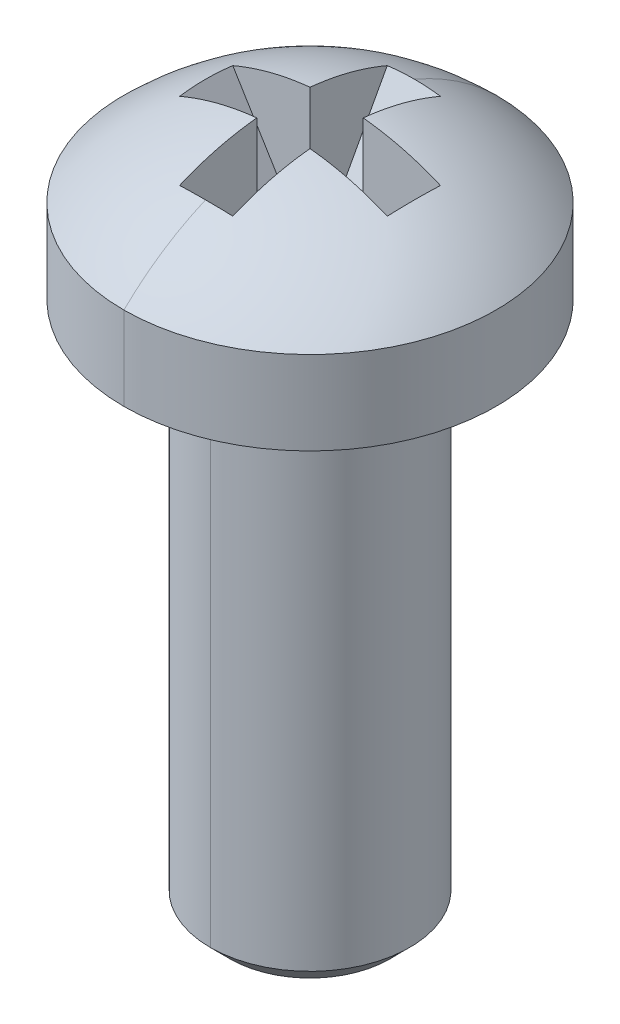
ISO-10303-21;
HEADER;
FILE_DESCRIPTION(('STEP AP214'),'2;1');
FILE_NAME('part.step','',(''),(''),'','','');
FILE_SCHEMA(('AUTOMOTIVE_DESIGN { 1 0 10303 214 1 1 1 1 }'));
ENDSEC;
DATA;
#1=APPLICATION_CONTEXT('core data for automotive mechanical design processes');
#2=APPLICATION_PROTOCOL_DEFINITION('international standard','automotive_design',2000,#1);
#3=PRODUCT_CONTEXT('',#1,'mechanical');
#4=PRODUCT('Part','Part','',(#3));
#5=PRODUCT_RELATED_PRODUCT_CATEGORY('part','',(#4));
#6=PRODUCT_DEFINITION_FORMATION('','',#4);
#7=PRODUCT_DEFINITION_CONTEXT('part definition',#1,'design');
#8=PRODUCT_DEFINITION('design','',#6,#7);
#9=PRODUCT_DEFINITION_SHAPE('','',#8);
#10=(LENGTH_UNIT() NAMED_UNIT(*) SI_UNIT(.MILLI.,.METRE.));
#11=(NAMED_UNIT(*) PLANE_ANGLE_UNIT() SI_UNIT($,.RADIAN.));
#12=(NAMED_UNIT(*) SI_UNIT($,.STERADIAN.) SOLID_ANGLE_UNIT());
#13=UNCERTAINTY_MEASURE_WITH_UNIT(LENGTH_MEASURE(1.E-05),#10,'distance_accuracy_value','');
#14=(GEOMETRIC_REPRESENTATION_CONTEXT(3) GLOBAL_UNCERTAINTY_ASSIGNED_CONTEXT((#13)) GLOBAL_UNIT_ASSIGNED_CONTEXT((#10,
#11,#12)) REPRESENTATION_CONTEXT('',''));
#15=CARTESIAN_POINT('',(0.,0.,0.));
#16=DIRECTION('',(0.,0.,1.));
#17=DIRECTION('',(1.,0.,0.));
#18=AXIS2_PLACEMENT_3D('',#15,#16,#17);
#19=CARTESIAN_POINT('',(0.,-8.,0.));
#20=DIRECTION('',(0.,-1.,0.));
#21=DIRECTION('',(0.,0.,-1.));
#22=AXIS2_PLACEMENT_3D('',#19,#20,#21);
#23=PLANE('',#22);
#24=CARTESIAN_POINT('',(0.,-8.,0.));
#25=DIRECTION('',(0.,-1.,0.));
#26=DIRECTION('',(0.,0.,-1.));
#27=AXIS2_PLACEMENT_3D('',#24,#25,#26);
#28=CIRCLE('',#27,1.2);
#29=CARTESIAN_POINT('',(0.,-8.,-1.2));
#30=VERTEX_POINT('',#29);
#31=CARTESIAN_POINT('',(0.,-8.,1.2));
#32=VERTEX_POINT('',#31);
#33=EDGE_CURVE('P0_E11',#30,#32,#28,.T.);
#34=ORIENTED_EDGE('',*,*,#33,.T.);
#35=CARTESIAN_POINT('',(0.,-8.,0.));
#36=DIRECTION('',(0.,1.,0.));
#37=DIRECTION('',(0.,0.,-1.));
#38=AXIS2_PLACEMENT_3D('',#35,#36,#37);
#39=CIRCLE('',#38,1.2);
#40=EDGE_CURVE('P0_E271',#30,#32,#39,.T.);
#41=ORIENTED_EDGE('',*,*,#40,.F.);
#42=EDGE_LOOP('',(#34,#41));
#43=FACE_BOUND('',#42,.T.);
#44=ADVANCED_FACE('P0_F17',(#43),#23,.T.);
#45=CARTESIAN_POINT('',(0.,-7.85,0.));
#46=DIRECTION('',(0.,1.,0.));
#47=DIRECTION('',(0.,0.,-1.));
#48=AXIS2_PLACEMENT_3D('',#45,#46,#47);
#49=CONICAL_SURFACE('',#48,1.35,0.7853981633973);
#50=CARTESIAN_POINT('',(0.,-7.7,0.));
#51=DIRECTION('',(0.,-1.,0.));
#52=DIRECTION('',(0.,0.,-1.));
#53=AXIS2_PLACEMENT_3D('',#50,#51,#52);
#54=CIRCLE('',#53,1.5);
#55=CARTESIAN_POINT('',(0.,-7.7,-1.5));
#56=VERTEX_POINT('',#55);
#57=CARTESIAN_POINT('',(0.,-7.7,1.5));
#58=VERTEX_POINT('',#57);
#59=EDGE_CURVE('P0_E171',#56,#58,#54,.T.);
#60=ORIENTED_EDGE('',*,*,#59,.T.);
#61=DIRECTION('',(0.,0.707106781186498,0.707106781186598));
#62=VECTOR('',#61,1.);
#63=CARTESIAN_POINT('',(0.,-8.,1.2));
#64=LINE('',#63,#62);
#65=EDGE_CURVE('P0_E20',#32,#58,#64,.T.);
#66=ORIENTED_EDGE('',*,*,#65,.F.);
#67=ORIENTED_EDGE('',*,*,#33,.F.);
#68=DIRECTION('',(0.,0.707106781186498,-0.707106781186598));
#69=VECTOR('',#68,1.);
#70=CARTESIAN_POINT('',(0.,-8.,-1.2));
#71=LINE('',#70,#69);
#72=EDGE_CURVE('P0_E26',#30,#56,#71,.T.);
#73=ORIENTED_EDGE('',*,*,#72,.T.);
#74=EDGE_LOOP('',(#60,#66,#67,#73));
#75=FACE_BOUND('',#74,.T.);
#76=ADVANCED_FACE('P0_F566',(#75),#49,.T.);
#77=CARTESIAN_POINT('',(0.,-7.85,0.));
#78=DIRECTION('',(0.,1.,0.));
#79=DIRECTION('',(0.,0.,-1.));
#80=AXIS2_PLACEMENT_3D('',#77,#78,#79);
#81=CONICAL_SURFACE('',#80,1.35,0.7853981633973);
#82=ORIENTED_EDGE('',*,*,#40,.T.);
#83=ORIENTED_EDGE('',*,*,#65,.T.);
#84=CARTESIAN_POINT('',(0.,-7.7,0.));
#85=DIRECTION('',(0.,1.,0.));
#86=DIRECTION('',(0.,0.,-1.));
#87=AXIS2_PLACEMENT_3D('',#84,#85,#86);
#88=CIRCLE('',#87,1.5);
#89=EDGE_CURVE('P0_E166',#56,#58,#88,.T.);
#90=ORIENTED_EDGE('',*,*,#89,.F.);
#91=ORIENTED_EDGE('',*,*,#72,.F.);
#92=EDGE_LOOP('',(#82,#83,#90,#91));
#93=FACE_BOUND('',#92,.T.);
#94=ADVANCED_FACE('P0_F570',(#93),#81,.T.);
#95=CARTESIAN_POINT('',(0.,2.92,0.));
#96=DIRECTION('',(0.,-1.,0.));
#97=DIRECTION('',(0.,0.,1.));
#98=AXIS2_PLACEMENT_3D('',#95,#96,#97);
#99=CYLINDRICAL_SURFACE('',#98,1.5);
#100=ORIENTED_EDGE('',*,*,#89,.T.);
#101=DIRECTION('',(0.,1.,0.));
#102=VECTOR('',#101,1.);
#103=CARTESIAN_POINT('',(0.,-7.7,1.5));
#104=LINE('',#103,#102);
#105=CARTESIAN_POINT('',(0.,0.,1.5));
#106=VERTEX_POINT('',#105);
#107=EDGE_CURVE('P0_E159',#58,#106,#104,.T.);
#108=ORIENTED_EDGE('',*,*,#107,.T.);
#109=CARTESIAN_POINT('',(0.,0.,0.));
#110=DIRECTION('',(0.,1.,0.));
#111=DIRECTION('',(0.,0.,-1.));
#112=AXIS2_PLACEMENT_3D('',#109,#110,#111);
#113=CIRCLE('',#112,1.5);
#114=CARTESIAN_POINT('',(0.,0.,-1.5));
#115=VERTEX_POINT('',#114);
#116=EDGE_CURVE('P0_E164',#115,#106,#113,.T.);
#117=ORIENTED_EDGE('',*,*,#116,.F.);
#118=DIRECTION('',(0.,1.,0.));
#119=VECTOR('',#118,1.);
#120=CARTESIAN_POINT('',(0.,-7.7,-1.5));
#121=LINE('',#120,#119);
#122=EDGE_CURVE('P0_E176',#56,#115,#121,.T.);
#123=ORIENTED_EDGE('',*,*,#122,.F.);
#124=EDGE_LOOP('',(#100,#108,#117,#123));
#125=FACE_BOUND('',#124,.T.);
#126=ADVANCED_FACE('P0_F161',(#125),#99,.T.);
#127=CARTESIAN_POINT('',(0.,2.92,0.));
#128=DIRECTION('',(0.,-1.,0.));
#129=DIRECTION('',(0.,0.,1.));
#130=AXIS2_PLACEMENT_3D('',#127,#128,#129);
#131=CYLINDRICAL_SURFACE('',#130,1.5);
#132=CARTESIAN_POINT('',(0.,0.,0.));
#133=DIRECTION('',(0.,-1.,0.));
#134=DIRECTION('',(0.,0.,-1.));
#135=AXIS2_PLACEMENT_3D('',#132,#133,#134);
#136=CIRCLE('',#135,1.5);
#137=EDGE_CURVE('P0_E172',#115,#106,#136,.T.);
#138=ORIENTED_EDGE('',*,*,#137,.T.);
#139=ORIENTED_EDGE('',*,*,#107,.F.);
#140=ORIENTED_EDGE('',*,*,#59,.F.);
#141=ORIENTED_EDGE('',*,*,#122,.T.);
#142=EDGE_LOOP('',(#138,#139,#140,#141));
#143=FACE_BOUND('',#142,.T.);
#144=ADVANCED_FACE('P0_F175',(#143),#131,.T.);
#145=CARTESIAN_POINT('',(0.,0.,0.));
#146=DIRECTION('',(0.,-1.,0.));
#147=DIRECTION('',(0.,0.,-1.));
#148=AXIS2_PLACEMENT_3D('',#145,#146,#147);
#149=PLANE('',#148);
#150=ORIENTED_EDGE('',*,*,#116,.T.);
#151=ORIENTED_EDGE('',*,*,#137,.F.);
#152=EDGE_LOOP('',(#150,#151));
#153=FACE_BOUND('',#152,.T.);
#154=CARTESIAN_POINT('',(0.,0.,0.));
#155=DIRECTION('',(0.,-1.,0.));
#156=DIRECTION('',(0.,0.,-1.));
#157=AXIS2_PLACEMENT_3D('',#154,#155,#156);
#158=CIRCLE('',#157,2.8);
#159=CARTESIAN_POINT('',(0.,0.,-2.8));
#160=VERTEX_POINT('',#159);
#161=CARTESIAN_POINT('',(0.,0.,2.8));
#162=VERTEX_POINT('',#161);
#163=EDGE_CURVE('P0_E183',#160,#162,#158,.T.);
#164=ORIENTED_EDGE('',*,*,#163,.T.);
#165=CARTESIAN_POINT('',(0.,0.,0.));
#166=DIRECTION('',(0.,1.,0.));
#167=DIRECTION('',(0.,0.,-1.));
#168=AXIS2_PLACEMENT_3D('',#165,#166,#167);
#169=CIRCLE('',#168,2.8);
#170=EDGE_CURVE('P0_E203',#160,#162,#169,.T.);
#171=ORIENTED_EDGE('',*,*,#170,.F.);
#172=EDGE_LOOP('',(#164,#171));
#173=FACE_BOUND('',#172,.T.);
#174=ADVANCED_FACE('P0_F180',(#153,#173),#149,.T.);
#175=CARTESIAN_POINT('',(0.,2.92,0.));
#176=DIRECTION('',(0.,-1.,0.));
#177=DIRECTION('',(0.,0.,1.));
#178=AXIS2_PLACEMENT_3D('',#175,#176,#177);
#179=CYLINDRICAL_SURFACE('',#178,2.8);
#180=CARTESIAN_POINT('',(0.,1.256571371417,0.));
#181=DIRECTION('',(0.,-1.,0.));
#182=DIRECTION('',(0.,0.,-1.));
#183=AXIS2_PLACEMENT_3D('',#180,#181,#182);
#184=CIRCLE('',#183,2.8);
#185=CARTESIAN_POINT('',(0.,1.256571371417,-2.8));
#186=VERTEX_POINT('',#185);
#187=CARTESIAN_POINT('',(0.,1.256571371417,2.8));
#188=VERTEX_POINT('',#187);
#189=EDGE_CURVE('P0_E464',#186,#188,#184,.T.);
#190=ORIENTED_EDGE('',*,*,#189,.T.);
#191=DIRECTION('',(0.,1.,0.));
#192=VECTOR('',#191,1.);
#193=CARTESIAN_POINT('',(0.,0.,2.8));
#194=LINE('',#193,#192);
#195=EDGE_CURVE('P0_E250',#162,#188,#194,.T.);
#196=ORIENTED_EDGE('',*,*,#195,.F.);
#197=ORIENTED_EDGE('',*,*,#163,.F.);
#198=DIRECTION('',(0.,1.,0.));
#199=VECTOR('',#198,1.);
#200=CARTESIAN_POINT('',(0.,0.,-2.8));
#201=LINE('',#200,#199);
#202=EDGE_CURVE('P0_E189',#160,#186,#201,.T.);
#203=ORIENTED_EDGE('',*,*,#202,.T.);
#204=EDGE_LOOP('',(#190,#196,#197,#203));
#205=FACE_BOUND('',#204,.T.);
#206=ADVANCED_FACE('P0_F551',(#205),#179,.T.);
#207=CARTESIAN_POINT('',(0.,2.92,0.));
#208=DIRECTION('',(0.,-1.,0.));
#209=DIRECTION('',(0.,0.,1.));
#210=AXIS2_PLACEMENT_3D('',#207,#208,#209);
#211=CYLINDRICAL_SURFACE('',#210,2.8);
#212=ORIENTED_EDGE('',*,*,#170,.T.);
#213=ORIENTED_EDGE('',*,*,#195,.T.);
#214=CARTESIAN_POINT('',(0.,1.256571371417,0.));
#215=DIRECTION('',(0.,1.,0.));
#216=DIRECTION('',(0.,0.,-1.));
#217=AXIS2_PLACEMENT_3D('',#214,#215,#216);
#218=CIRCLE('',#217,2.8);
#219=EDGE_CURVE('P0_E224',#186,#188,#218,.T.);
#220=ORIENTED_EDGE('',*,*,#219,.F.);
#221=ORIENTED_EDGE('',*,*,#202,.F.);
#222=EDGE_LOOP('',(#212,#213,#220,#221));
#223=FACE_BOUND('',#222,.T.);
#224=ADVANCED_FACE('P0_F547',(#223),#211,.T.);
#225=CARTESIAN_POINT('',(0.,0.,0.4));
#226=DIRECTION('',(0.,0.,1.));
#227=DIRECTION('',(1.,0.,0.));
#228=AXIS2_PLACEMENT_3D('',#225,#226,#227);
#229=PLANE('',#228);
#230=DIRECTION('',(0.,-1.,0.));
#231=VECTOR('',#230,1.);
#232=CARTESIAN_POINT('',(-0.4,2.359797974645,0.4));
#233=LINE('',#232,#231);
#234=CARTESIAN_POINT('',(-0.4,2.359797974645,0.4));
#235=VERTEX_POINT('',#234);
#236=CARTESIAN_POINT('',(-0.4,0.1594760794726,0.4));
#237=VERTEX_POINT('',#236);
#238=EDGE_CURVE('P0_E243',#235,#237,#233,.T.);
#239=ORIENTED_EDGE('',*,*,#238,.T.);
#240=DIRECTION('',(0.521313752334012,-0.853365086951319,0.));
#241=VECTOR('',#240,1.);
#242=CARTESIAN_POINT('',(-1.561519847402,2.060827196983,0.4));
#243=LINE('',#242,#241);
#244=CARTESIAN_POINT('',(-1.561519847402,2.060827196983,0.4));
#245=VERTEX_POINT('',#244);
#246=EDGE_CURVE('P0_E195',#245,#237,#243,.T.);
#247=ORIENTED_EDGE('',*,*,#246,.F.);
#248=CARTESIAN_POINT('',(0.,-1.6,0.4));
#249=DIRECTION('',(0.,0.,1.));
#250=DIRECTION('',(-0.100503781525898,0.994936676326184,0.));
#251=AXIS2_PLACEMENT_3D('',#248,#249,#250);
#252=CIRCLE('',#251,3.979949748426);
#253=EDGE_CURVE('P0_E238',#235,#245,#252,.T.);
#254=ORIENTED_EDGE('',*,*,#253,.F.);
#255=EDGE_LOOP('',(#239,#247,#254));
#256=FACE_BOUND('',#255,.T.);
#257=ADVANCED_FACE('P0_F403',(#256),#229,.F.);
#258=CARTESIAN_POINT('',(0.,0.,0.4));
#259=DIRECTION('',(0.,0.,1.));
#260=DIRECTION('',(1.,0.,0.));
#261=AXIS2_PLACEMENT_3D('',#258,#259,#260);
#262=PLANE('',#261);
#263=DIRECTION('',(1.,0.,0.));
#264=VECTOR('',#263,1.);
#265=CARTESIAN_POINT('',(-0.241488185187,-0.1,0.4));
#266=LINE('',#265,#264);
#267=CARTESIAN_POINT('',(-0.241488185187,-0.1,0.4));
#268=VERTEX_POINT('',#267);
#269=CARTESIAN_POINT('',(0.3855408748608,-0.1,0.4));
#270=VERTEX_POINT('',#269);
#271=EDGE_CURVE('P0_E242',#268,#270,#266,.T.);
#272=ORIENTED_EDGE('',*,*,#271,.F.);
#273=DIRECTION('',(0.521313752334012,-0.853365086951319,0.));
#274=VECTOR('',#273,1.);
#275=CARTESIAN_POINT('',(-0.4,0.1594760794726,0.4));
#276=LINE('',#275,#274);
#277=EDGE_CURVE('P0_E215',#237,#268,#276,.T.);
#278=ORIENTED_EDGE('',*,*,#277,.F.);
#279=DIRECTION('',(1.,0.,0.));
#280=VECTOR('',#279,1.);
#281=CARTESIAN_POINT('',(-0.4,0.1594760794726,0.4));
#282=LINE('',#281,#280);
#283=CARTESIAN_POINT('',(0.4,0.1594760794726,0.4));
#284=VERTEX_POINT('',#283);
#285=EDGE_CURVE('P0_E199',#237,#284,#282,.T.);
#286=ORIENTED_EDGE('',*,*,#285,.T.);
#287=DIRECTION('',(0.,-1.,0.));
#288=VECTOR('',#287,1.);
#289=CARTESIAN_POINT('',(0.4,2.359797974645,0.4));
#290=LINE('',#289,#288);
#291=CARTESIAN_POINT('',(0.4,2.359797974645,0.4));
#292=VERTEX_POINT('',#291);
#293=EDGE_CURVE('P0_E286',#292,#284,#290,.T.);
#294=ORIENTED_EDGE('',*,*,#293,.F.);
#295=CARTESIAN_POINT('',(0.,-1.6,0.4));
#296=DIRECTION('',(0.,0.,1.));
#297=DIRECTION('',(0.392579766011815,0.919717960745634,0.));
#298=AXIS2_PLACEMENT_3D('',#295,#296,#297);
#299=CIRCLE('',#298,3.979949748426);
#300=CARTESIAN_POINT('',(1.562447740976,2.060431266493,0.4));
#301=VERTEX_POINT('',#300);
#302=EDGE_CURVE('P0_E480',#301,#292,#299,.T.);
#303=ORIENTED_EDGE('',*,*,#302,.F.);
#304=DIRECTION('',(0.478378967835591,0.878153496339083,0.));
#305=VECTOR('',#304,1.);
#306=CARTESIAN_POINT('',(0.3855408748608,-0.1,0.4));
#307=LINE('',#306,#305);
#308=EDGE_CURVE('P0_E342',#270,#301,#307,.T.);
#309=ORIENTED_EDGE('',*,*,#308,.F.);
#310=EDGE_LOOP('',(#272,#278,#286,#294,#303,#309));
#311=FACE_BOUND('',#310,.T.);
#312=ADVANCED_FACE('P0_F422',(#311),#262,.F.);
#313=CARTESIAN_POINT('',(-0.4,2.078118441512,1.572082927268));
#314=DIRECTION('',(0.,-0.521313752334012,0.853365086951319));
#315=DIRECTION('',(-1.,0.,0.));
#316=AXIS2_PLACEMENT_3D('',#313,#314,#315);
#317=PLANE('',#316);
#318=DIRECTION('',(0.,-0.853365086951319,-0.521313752334012));
#319=VECTOR('',#318,1.);
#320=CARTESIAN_POINT('',(0.4,-0.07345758875551,0.2577027271379));
#321=LINE('',#320,#319);
#322=CARTESIAN_POINT('',(0.4,-0.07345758875551,0.2577027271379));
#323=VERTEX_POINT('',#322);
#324=CARTESIAN_POINT('',(0.4,-0.1,0.241488185187));
#325=VERTEX_POINT('',#324);
#326=EDGE_CURVE('P0_E292',#323,#325,#321,.T.);
#327=ORIENTED_EDGE('',*,*,#326,.T.);
#328=DIRECTION('',(1.,0.,0.));
#329=VECTOR('',#328,1.);
#330=CARTESIAN_POINT('',(0.3855408748608,-0.1,0.241488185187));
#331=LINE('',#330,#329);
#332=CARTESIAN_POINT('',(0.3855408748608,-0.1,0.241488185187));
#333=VERTEX_POINT('',#332);
#334=EDGE_CURVE('P0_E204',#333,#325,#331,.T.);
#335=ORIENTED_EDGE('',*,*,#334,.F.);
#336=DIRECTION('',(0.421551119413801,0.773835419800602,0.472729729108501));
#337=VECTOR('',#336,1.);
#338=CARTESIAN_POINT('',(0.3855408748608,-0.1,0.241488185187));
#339=LINE('',#338,#337);
#340=EDGE_CURVE('P0_E332',#333,#323,#339,.T.);
#341=ORIENTED_EDGE('',*,*,#340,.T.);
#342=EDGE_LOOP('',(#327,#335,#341));
#343=FACE_BOUND('',#342,.T.);
#344=ADVANCED_FACE('P0_F615',(#343),#317,.F.);
#345=CARTESIAN_POINT('',(-0.4,2.078118441512,1.572082927268));
#346=DIRECTION('',(0.,-0.521313752334012,0.853365086951319));
#347=DIRECTION('',(-1.,0.,0.));
#348=AXIS2_PLACEMENT_3D('',#345,#346,#347);
#349=PLANE('',#348);
#350=DIRECTION('',(1.,0.,0.));
#351=VECTOR('',#350,1.);
#352=CARTESIAN_POINT('',(-0.4,-0.1,0.241488185187));
#353=LINE('',#352,#351);
#354=CARTESIAN_POINT('',(-0.4,-0.1,0.241488185187));
#355=VERTEX_POINT('',#354);
#356=CARTESIAN_POINT('',(-0.241488185187,-0.1,0.241488185187));
#357=VERTEX_POINT('',#356);
#358=EDGE_CURVE('P0_E239',#355,#357,#353,.T.);
#359=ORIENTED_EDGE('',*,*,#358,.F.);
#360=DIRECTION('',(0.,-0.853365086951319,-0.521313752334012));
#361=VECTOR('',#360,1.);
#362=CARTESIAN_POINT('',(-0.4,0.1594760794726,0.4));
#363=LINE('',#362,#361);
#364=EDGE_CURVE('P0_E244',#237,#355,#363,.T.);
#365=ORIENTED_EDGE('',*,*,#364,.F.);
#366=DIRECTION('',(-0.462269489645205,0.756712519974609,0.462269489645205));
#367=VECTOR('',#366,1.);
#368=CARTESIAN_POINT('',(-0.241488185187,-0.1,0.241488185187));
#369=LINE('',#368,#367);
#370=EDGE_CURVE('P0_E205',#357,#237,#369,.T.);
#371=ORIENTED_EDGE('',*,*,#370,.F.);
#372=EDGE_LOOP('',(#359,#365,#371));
#373=FACE_BOUND('',#372,.T.);
#374=ADVANCED_FACE('P0_F415',(#373),#349,.F.);
#375=CARTESIAN_POINT('',(-0.4,2.078118441512,1.572082927268));
#376=DIRECTION('',(0.,-0.521313752334012,0.853365086951319));
#377=DIRECTION('',(-1.,0.,0.));
#378=AXIS2_PLACEMENT_3D('',#375,#376,#377);
#379=PLANE('',#378);
#380=DIRECTION('',(0.,-0.853365086951319,-0.521313752334012));
#381=VECTOR('',#380,1.);
#382=CARTESIAN_POINT('',(-0.4,2.060827196983,1.561519847402));
#383=LINE('',#382,#381);
#384=CARTESIAN_POINT('',(-0.4,2.060827196983,1.561519847402));
#385=VERTEX_POINT('',#384);
#386=EDGE_CURVE('P0_E256',#385,#237,#383,.T.);
#387=ORIENTED_EDGE('',*,*,#386,.F.);
#388=CARTESIAN_POINT('',(0.,-1.299779037149,-0.4914470161607));
#389=DIRECTION('',(0.,-0.521313752334012,0.853365086951319));
#390=DIRECTION('',(0.,0.853365086951319,0.521313752334012));
#391=AXIS2_PLACEMENT_3D('',#388,#389,#390);
#392=CIRCLE('',#391,3.958326313453);
#393=CARTESIAN_POINT('',(0.,2.078118441512,1.572082927268));
#394=VERTEX_POINT('',#393);
#395=EDGE_CURVE('P0_E230',#394,#385,#392,.T.);
#396=ORIENTED_EDGE('',*,*,#395,.F.);
#397=CARTESIAN_POINT('',(0.,-1.299779037149,-0.4914470161607));
#398=DIRECTION('',(0.,-0.521313752334015,0.853365086951317));
#399=DIRECTION('',(0.101052810790401,0.848996764796909,0.518645180056406));
#400=AXIS2_PLACEMENT_3D('',#397,#398,#399);
#401=CIRCLE('',#400,3.958326313453);
#402=CARTESIAN_POINT('',(0.4,2.060827196983,1.561519847402));
#403=VERTEX_POINT('',#402);
#404=EDGE_CURVE('P0_E481',#403,#394,#401,.T.);
#405=ORIENTED_EDGE('',*,*,#404,.F.);
#406=DIRECTION('',(0.,-0.853365086951319,-0.521313752334012));
#407=VECTOR('',#406,1.);
#408=CARTESIAN_POINT('',(0.4,2.060827196983,1.561519847402));
#409=LINE('',#408,#407);
#410=EDGE_CURVE('P0_E389',#403,#284,#409,.T.);
#411=ORIENTED_EDGE('',*,*,#410,.T.);
#412=ORIENTED_EDGE('',*,*,#285,.F.);
#413=EDGE_LOOP('',(#387,#396,#405,#411,#412));
#414=FACE_BOUND('',#413,.T.);
#415=ADVANCED_FACE('P0_F554',(#414),#379,.F.);
#416=CARTESIAN_POINT('',(-0.4,-0.1,0.241488185187));
#417=DIRECTION('',(0.,-1.,0.));
#418=DIRECTION('',(0.,0.,-1.));
#419=AXIS2_PLACEMENT_3D('',#416,#417,#418);
#420=PLANE('',#419);
#421=DIRECTION('',(0.,0.,-1.));
#422=VECTOR('',#421,1.);
#423=CARTESIAN_POINT('',(-0.4,-0.1,0.241488185187));
#424=LINE('',#423,#422);
#425=CARTESIAN_POINT('',(-0.4,-0.1,-0.3855408748608));
#426=VERTEX_POINT('',#425);
#427=EDGE_CURVE('P0_E248',#355,#426,#424,.T.);
#428=ORIENTED_EDGE('',*,*,#427,.F.);
#429=ORIENTED_EDGE('',*,*,#358,.T.);
#430=DIRECTION('',(0.,0.,1.));
#431=VECTOR('',#430,1.);
#432=CARTESIAN_POINT('',(-0.241488185187,-0.1,0.241488185187));
#433=LINE('',#432,#431);
#434=EDGE_CURVE('P0_E210',#357,#268,#433,.T.);
#435=ORIENTED_EDGE('',*,*,#434,.T.);
#436=ORIENTED_EDGE('',*,*,#271,.T.);
#437=DIRECTION('',(0.,0.,1.));
#438=VECTOR('',#437,1.);
#439=CARTESIAN_POINT('',(0.3855408748608,-0.1,0.241488185187));
#440=LINE('',#439,#438);
#441=EDGE_CURVE('P0_E338',#333,#270,#440,.T.);
#442=ORIENTED_EDGE('',*,*,#441,.F.);
#443=ORIENTED_EDGE('',*,*,#334,.T.);
#444=DIRECTION('',(0.,0.,-1.));
#445=VECTOR('',#444,1.);
#446=CARTESIAN_POINT('',(0.4,-0.1,0.241488185187));
#447=LINE('',#446,#445);
#448=CARTESIAN_POINT('',(0.4,-0.1,-0.3855408748608));
#449=VERTEX_POINT('',#448);
#450=EDGE_CURVE('P0_E372',#325,#449,#447,.T.);
#451=ORIENTED_EDGE('',*,*,#450,.T.);
#452=DIRECTION('',(1.,0.,0.));
#453=VECTOR('',#452,1.);
#454=CARTESIAN_POINT('',(0.3855408748608,-0.1,-0.3855408748608));
#455=LINE('',#454,#453);
#456=CARTESIAN_POINT('',(0.3855408748608,-0.1,-0.3855408748608));
#457=VERTEX_POINT('',#456);
#458=EDGE_CURVE('P0_E193',#457,#449,#455,.T.);
#459=ORIENTED_EDGE('',*,*,#458,.F.);
#460=DIRECTION('',(0.,0.,1.));
#461=VECTOR('',#460,1.);
#462=CARTESIAN_POINT('',(0.3855408748608,-0.1,-0.4));
#463=LINE('',#462,#461);
#464=CARTESIAN_POINT('',(0.3855408748608,-0.1,-0.4));
#465=VERTEX_POINT('',#464);
#466=EDGE_CURVE('P0_E324',#465,#457,#463,.T.);
#467=ORIENTED_EDGE('',*,*,#466,.F.);
#468=DIRECTION('',(1.,0.,0.));
#469=VECTOR('',#468,1.);
#470=CARTESIAN_POINT('',(-0.241488185187,-0.1,-0.4));
#471=LINE('',#470,#469);
#472=CARTESIAN_POINT('',(-0.241488185187,-0.1,-0.4));
#473=VERTEX_POINT('',#472);
#474=EDGE_CURVE('P0_E299',#473,#465,#471,.T.);
#475=ORIENTED_EDGE('',*,*,#474,.F.);
#476=DIRECTION('',(0.,0.,1.));
#477=VECTOR('',#476,1.);
#478=CARTESIAN_POINT('',(-0.241488185187,-0.1,-0.4));
#479=LINE('',#478,#477);
#480=CARTESIAN_POINT('',(-0.241488185187,-0.1,-0.3855408748608));
#481=VERTEX_POINT('',#480);
#482=EDGE_CURVE('P0_E209',#473,#481,#479,.T.);
#483=ORIENTED_EDGE('',*,*,#482,.T.);
#484=DIRECTION('',(1.,0.,0.));
#485=VECTOR('',#484,1.);
#486=CARTESIAN_POINT('',(-0.4,-0.1,-0.3855408748608));
#487=LINE('',#486,#485);
#488=EDGE_CURVE('P0_E351',#426,#481,#487,.T.);
#489=ORIENTED_EDGE('',*,*,#488,.F.);
#490=EDGE_LOOP('',(#428,#429,#435,#436,#442,#443,#451,#459,#467,#475,#483,#489));
#491=FACE_BOUND('',#490,.T.);
#492=ADVANCED_FACE('P0_F374',(#491),#420,.F.);
#493=CARTESIAN_POINT('',(-0.4,0.,0.));
#494=DIRECTION('',(1.,0.,0.));
#495=DIRECTION('',(0.,1.,0.));
#496=AXIS2_PLACEMENT_3D('',#493,#494,#495);
#497=PLANE('',#496);
#498=CARTESIAN_POINT('',(-0.4,-1.6,0.));
#499=DIRECTION('',(1.,0.,0.));
#500=DIRECTION('',(0.,0.994936676326184,0.100503781525898));
#501=AXIS2_PLACEMENT_3D('',#498,#499,#500);
#502=CIRCLE('',#501,3.979949748426);
#503=EDGE_CURVE('P0_E234',#235,#385,#502,.T.);
#504=ORIENTED_EDGE('',*,*,#503,.T.);
#505=ORIENTED_EDGE('',*,*,#386,.T.);
#506=ORIENTED_EDGE('',*,*,#238,.F.);
#507=EDGE_LOOP('',(#504,#505,#506));
#508=FACE_BOUND('',#507,.T.);
#509=ADVANCED_FACE('P0_F408',(#508),#497,.T.);
#510=CARTESIAN_POINT('',(-0.4,0.,0.));
#511=DIRECTION('',(1.,0.,0.));
#512=DIRECTION('',(0.,1.,0.));
#513=AXIS2_PLACEMENT_3D('',#510,#511,#512);
#514=PLANE('',#513);
#515=DIRECTION('',(0.,-1.,0.));
#516=VECTOR('',#515,1.);
#517=CARTESIAN_POINT('',(-0.4,2.359797974645,-0.4));
#518=LINE('',#517,#516);
#519=CARTESIAN_POINT('',(-0.4,2.359797974645,-0.4));
#520=VERTEX_POINT('',#519);
#521=CARTESIAN_POINT('',(-0.4,0.1594760794726,-0.4));
#522=VERTEX_POINT('',#521);
#523=EDGE_CURVE('P0_E316',#520,#522,#518,.T.);
#524=ORIENTED_EDGE('',*,*,#523,.T.);
#525=DIRECTION('',(0.,0.,1.));
#526=VECTOR('',#525,1.);
#527=CARTESIAN_POINT('',(-0.4,0.1594760794726,-0.4));
#528=LINE('',#527,#526);
#529=EDGE_CURVE('P0_E198',#522,#237,#528,.T.);
#530=ORIENTED_EDGE('',*,*,#529,.T.);
#531=ORIENTED_EDGE('',*,*,#364,.T.);
#532=ORIENTED_EDGE('',*,*,#427,.T.);
#533=DIRECTION('',(0.,0.878153496339083,-0.478378967835591));
#534=VECTOR('',#533,1.);
#535=CARTESIAN_POINT('',(-0.4,-0.1,-0.3855408748608));
#536=LINE('',#535,#534);
#537=CARTESIAN_POINT('',(-0.4,2.060431266493,-1.562447740976));
#538=VERTEX_POINT('',#537);
#539=EDGE_CURVE('P0_E350',#426,#538,#536,.T.);
#540=ORIENTED_EDGE('',*,*,#539,.T.);
#541=CARTESIAN_POINT('',(-0.4,-1.6,0.));
#542=DIRECTION('',(1.,0.,0.));
#543=DIRECTION('',(0.,0.919717960745634,-0.392579766011815));
#544=AXIS2_PLACEMENT_3D('',#541,#542,#543);
#545=CIRCLE('',#544,3.979949748426);
#546=EDGE_CURVE('P0_E249',#538,#520,#545,.T.);
#547=ORIENTED_EDGE('',*,*,#546,.T.);
#548=EDGE_LOOP('',(#524,#530,#531,#532,#540,#547));
#549=FACE_BOUND('',#548,.T.);
#550=ADVANCED_FACE('P0_F425',(#549),#514,.T.);
#551=CARTESIAN_POINT('',(0.,-1.6,0.));
#552=DIRECTION('',(0.,-1.,0.));
#553=DIRECTION('',(0.,0.,1.));
#554=AXIS2_PLACEMENT_3D('',#551,#552,#553);
#555=SPHERICAL_SURFACE('',#554,4.);
#556=CARTESIAN_POINT('',(0.,-1.418692273732,0.3328240253877));
#557=DIRECTION('',(0.,-0.478378967835579,-0.878153496339089));
#558=DIRECTION('',(-0.100451933816205,0.873711719002947,-0.475959285096426));
#559=AXIS2_PLACEMENT_3D('',#556,#557,#558);
#560=CIRCLE('',#559,3.982003977462);
#561=CARTESIAN_POINT('',(0.,2.078118441512,-1.572082927268));
#562=VERTEX_POINT('',#561);
#563=EDGE_CURVE('P0_E346',#538,#562,#560,.T.);
#564=ORIENTED_EDGE('',*,*,#563,.T.);
#565=CARTESIAN_POINT('',(0.,-1.6,0.));
#566=DIRECTION('',(1.,0.,0.));
#567=DIRECTION('',(0.,0.714142842854292,-0.7));
#568=AXIS2_PLACEMENT_3D('',#565,#566,#567);
#569=CIRCLE('',#568,4.);
#570=EDGE_CURVE('P0_E457',#186,#562,#569,.T.);
#571=ORIENTED_EDGE('',*,*,#570,.F.);
#572=ORIENTED_EDGE('',*,*,#219,.T.);
#573=CARTESIAN_POINT('',(0.,-1.6,0.));
#574=DIRECTION('',(-1.,0.,0.));
#575=DIRECTION('',(0.,0.714142842854292,0.7));
#576=AXIS2_PLACEMENT_3D('',#573,#574,#575);
#577=CIRCLE('',#576,4.);
#578=EDGE_CURVE('P0_E470',#188,#394,#577,.T.);
#579=ORIENTED_EDGE('',*,*,#578,.T.);
#580=ORIENTED_EDGE('',*,*,#395,.T.);
#581=ORIENTED_EDGE('',*,*,#503,.F.);
#582=ORIENTED_EDGE('',*,*,#253,.T.);
#583=CARTESIAN_POINT('',(0.4914470161607,-1.299779037149,0.));
#584=DIRECTION('',(0.853365086951317,0.521313752334015,0.));
#585=DIRECTION('',(-0.518645180056406,0.848996764796909,-0.101052810790401));
#586=AXIS2_PLACEMENT_3D('',#583,#584,#585);
#587=CIRCLE('',#586,3.958326313453);
#588=CARTESIAN_POINT('',(-1.561519847402,2.060827196983,-0.4));
#589=VERTEX_POINT('',#588);
#590=EDGE_CURVE('P0_E214',#589,#245,#587,.T.);
#591=ORIENTED_EDGE('',*,*,#590,.F.);
#592=CARTESIAN_POINT('',(0.,-1.6,-0.4));
#593=DIRECTION('',(0.,0.,1.));
#594=DIRECTION('',(-0.100503781525898,0.994936676326184,0.));
#595=AXIS2_PLACEMENT_3D('',#592,#593,#594);
#596=CIRCLE('',#595,3.979949748426);
#597=EDGE_CURVE('P0_E320',#520,#589,#596,.T.);
#598=ORIENTED_EDGE('',*,*,#597,.F.);
#599=ORIENTED_EDGE('',*,*,#546,.F.);
#600=EDGE_LOOP('',(#564,#571,#572,#579,#580,#581,#582,#591,#598,#599));
#601=FACE_BOUND('',#600,.T.);
#602=ADVANCED_FACE('P0_F430',(#601),#555,.T.);
#603=CARTESIAN_POINT('',(-1.572082927268,2.078118441512,-0.4));
#604=DIRECTION('',(-0.853365086951319,-0.521313752334012,0.));
#605=DIRECTION('',(-0.521313752334012,0.853365086951319,0.));
#606=AXIS2_PLACEMENT_3D('',#603,#604,#605);
#607=PLANE('',#606);
#608=ORIENTED_EDGE('',*,*,#482,.F.);
#609=DIRECTION('',(0.521313752334012,-0.853365086951319,0.));
#610=VECTOR('',#609,1.);
#611=CARTESIAN_POINT('',(-0.2577027271379,-0.07345758875551,-0.4));
#612=LINE('',#611,#610);
#613=CARTESIAN_POINT('',(-0.2577027271379,-0.07345758875551,-0.4));
#614=VERTEX_POINT('',#613);
#615=EDGE_CURVE('P0_E296',#614,#473,#612,.T.);
#616=ORIENTED_EDGE('',*,*,#615,.F.);
#617=DIRECTION('',(-0.472729729108501,0.773835419800602,-0.421551119413801));
#618=VECTOR('',#617,1.);
#619=CARTESIAN_POINT('',(-0.241488185187,-0.1,-0.3855408748608));
#620=LINE('',#619,#618);
#621=EDGE_CURVE('P0_E354',#481,#614,#620,.T.);
#622=ORIENTED_EDGE('',*,*,#621,.F.);
#623=EDGE_LOOP('',(#608,#616,#622));
#624=FACE_BOUND('',#623,.T.);
#625=ADVANCED_FACE('P0_F647',(#624),#607,.F.);
#626=CARTESIAN_POINT('',(-1.572082927268,2.078118441512,-0.4));
#627=DIRECTION('',(-0.853365086951319,-0.521313752334012,0.));
#628=DIRECTION('',(-0.521313752334012,0.853365086951319,0.));
#629=AXIS2_PLACEMENT_3D('',#626,#627,#628);
#630=PLANE('',#629);
#631=ORIENTED_EDGE('',*,*,#277,.T.);
#632=ORIENTED_EDGE('',*,*,#434,.F.);
#633=ORIENTED_EDGE('',*,*,#370,.T.);
#634=EDGE_LOOP('',(#631,#632,#633));
#635=FACE_BOUND('',#634,.T.);
#636=ADVANCED_FACE('P0_F420',(#635),#630,.F.);
#637=CARTESIAN_POINT('',(-1.572082927268,2.078118441512,-0.4));
#638=DIRECTION('',(-0.853365086951319,-0.521313752334012,0.));
#639=DIRECTION('',(-0.521313752334012,0.853365086951319,0.));
#640=AXIS2_PLACEMENT_3D('',#637,#638,#639);
#641=PLANE('',#640);
#642=ORIENTED_EDGE('',*,*,#246,.T.);
#643=ORIENTED_EDGE('',*,*,#529,.F.);
#644=DIRECTION('',(0.521313752334012,-0.853365086951319,0.));
#645=VECTOR('',#644,1.);
#646=CARTESIAN_POINT('',(-1.561519847402,2.060827196983,-0.4));
#647=LINE('',#646,#645);
#648=EDGE_CURVE('P0_E312',#589,#522,#647,.T.);
#649=ORIENTED_EDGE('',*,*,#648,.F.);
#650=ORIENTED_EDGE('',*,*,#590,.T.);
#651=EDGE_LOOP('',(#642,#643,#649,#650));
#652=FACE_BOUND('',#651,.T.);
#653=ADVANCED_FACE('P0_F398',(#652),#641,.F.);
#654=CARTESIAN_POINT('',(-0.4,-0.1,-0.3855408748608));
#655=DIRECTION('',(0.,-0.478378967835591,-0.878153496339083));
#656=DIRECTION('',(0.,-0.878153496339083,0.478378967835591));
#657=AXIS2_PLACEMENT_3D('',#654,#655,#656);
#658=PLANE('',#657);
#659=ORIENTED_EDGE('',*,*,#458,.T.);
#660=DIRECTION('',(0.,0.878153496339083,-0.478378967835591));
#661=VECTOR('',#660,1.);
#662=CARTESIAN_POINT('',(0.4,-0.1,-0.3855408748608));
#663=LINE('',#662,#661);
#664=CARTESIAN_POINT('',(0.4,-0.07345758875551,-0.4));
#665=VERTEX_POINT('',#664);
#666=EDGE_CURVE('P0_E368',#449,#665,#663,.T.);
#667=ORIENTED_EDGE('',*,*,#666,.T.);
#668=DIRECTION('',(0.431542198894386,0.792175902907174,-0.431542198894386));
#669=VECTOR('',#668,1.);
#670=CARTESIAN_POINT('',(0.3855408748608,-0.1,-0.3855408748608));
#671=LINE('',#670,#669);
#672=EDGE_CURVE('P0_E328',#457,#665,#671,.T.);
#673=ORIENTED_EDGE('',*,*,#672,.F.);
#674=EDGE_LOOP('',(#659,#667,#673));
#675=FACE_BOUND('',#674,.T.);
#676=ADVANCED_FACE('P0_F365',(#675),#658,.F.);
#677=CARTESIAN_POINT('',(-0.4,-0.1,-0.3855408748608));
#678=DIRECTION('',(0.,-0.478378967835591,-0.878153496339083));
#679=DIRECTION('',(0.,-0.878153496339083,0.478378967835591));
#680=AXIS2_PLACEMENT_3D('',#677,#678,#679);
#681=PLANE('',#680);
#682=DIRECTION('',(0.,0.878153496339083,-0.47837896783559));
#683=VECTOR('',#682,1.);
#684=CARTESIAN_POINT('',(0.4,-0.07345758875551,-0.4));
#685=LINE('',#684,#683);
#686=CARTESIAN_POINT('',(0.4,2.060431266493,-1.562447740976));
#687=VERTEX_POINT('',#686);
#688=EDGE_CURVE('P0_E448',#665,#687,#685,.T.);
#689=ORIENTED_EDGE('',*,*,#688,.T.);
#690=CARTESIAN_POINT('',(0.,-1.418692273732,0.3328240253877));
#691=DIRECTION('',(0.,-0.478378967835591,-0.878153496339083));
#692=DIRECTION('',(0.,0.878153496339083,-0.478378967835591));
#693=AXIS2_PLACEMENT_3D('',#690,#691,#692);
#694=CIRCLE('',#693,3.982003977462);
#695=EDGE_CURVE('P0_E444',#562,#687,#694,.T.);
#696=ORIENTED_EDGE('',*,*,#695,.F.);
#697=ORIENTED_EDGE('',*,*,#563,.F.);
#698=ORIENTED_EDGE('',*,*,#539,.F.);
#699=ORIENTED_EDGE('',*,*,#488,.T.);
#700=ORIENTED_EDGE('',*,*,#621,.T.);
#701=DIRECTION('',(1.,0.,0.));
#702=VECTOR('',#701,1.);
#703=CARTESIAN_POINT('',(-0.2577027271379,-0.07345758875551,-0.4));
#704=LINE('',#703,#702);
#705=EDGE_CURVE('P0_E291',#614,#665,#704,.T.);
#706=ORIENTED_EDGE('',*,*,#705,.T.);
#707=EDGE_LOOP('',(#689,#696,#697,#698,#699,#700,#706));
#708=FACE_BOUND('',#707,.T.);
#709=ADVANCED_FACE('P0_F442',(#708),#681,.F.);
#710=CARTESIAN_POINT('',(0.3855408748608,-0.1,-0.4));
#711=DIRECTION('',(0.878153496339083,-0.478378967835591,0.));
#712=DIRECTION('',(0.,0.,-1.));
#713=AXIS2_PLACEMENT_3D('',#710,#711,#712);
#714=PLANE('',#713);
#715=CARTESIAN_POINT('',(-0.3328240253877,-1.418692273732,0.));
#716=DIRECTION('',(-0.878153496339089,0.478378967835579,0.));
#717=DIRECTION('',(0.475959285096426,0.873711719002947,0.100451933816205));
#718=AXIS2_PLACEMENT_3D('',#715,#716,#717);
#719=CIRCLE('',#718,3.982003977462);
#720=CARTESIAN_POINT('',(1.562447740976,2.060431266493,-0.4));
#721=VERTEX_POINT('',#720);
#722=EDGE_CURVE('P0_E475',#301,#721,#719,.T.);
#723=ORIENTED_EDGE('',*,*,#722,.T.);
#724=DIRECTION('',(0.47837896783559,0.878153496339083,0.));
#725=VECTOR('',#724,1.);
#726=CARTESIAN_POINT('',(0.4,-0.07345758875551,-0.4));
#727=LINE('',#726,#725);
#728=EDGE_CURVE('P0_E308',#665,#721,#727,.T.);
#729=ORIENTED_EDGE('',*,*,#728,.F.);
#730=DIRECTION('',(0.,0.,1.));
#731=VECTOR('',#730,1.);
#732=CARTESIAN_POINT('',(0.4,-0.07345758875551,-0.4));
#733=LINE('',#732,#731);
#734=EDGE_CURVE('P0_E288',#665,#323,#733,.T.);
#735=ORIENTED_EDGE('',*,*,#734,.T.);
#736=ORIENTED_EDGE('',*,*,#340,.F.);
#737=ORIENTED_EDGE('',*,*,#441,.T.);
#738=ORIENTED_EDGE('',*,*,#308,.T.);
#739=EDGE_LOOP('',(#723,#729,#735,#736,#737,#738));
#740=FACE_BOUND('',#739,.T.);
#741=ADVANCED_FACE('P0_F681',(#740),#714,.F.);
#742=CARTESIAN_POINT('',(0.3855408748608,-0.1,-0.4));
#743=DIRECTION('',(0.878153496339083,-0.478378967835591,0.));
#744=DIRECTION('',(0.,0.,-1.));
#745=AXIS2_PLACEMENT_3D('',#742,#743,#744);
#746=PLANE('',#745);
#747=ORIENTED_EDGE('',*,*,#466,.T.);
#748=ORIENTED_EDGE('',*,*,#672,.T.);
#749=DIRECTION('',(0.478378967835591,0.878153496339083,0.));
#750=VECTOR('',#749,1.);
#751=CARTESIAN_POINT('',(0.3855408748608,-0.1,-0.4));
#752=LINE('',#751,#750);
#753=EDGE_CURVE('P0_E304',#465,#665,#752,.T.);
#754=ORIENTED_EDGE('',*,*,#753,.F.);
#755=EDGE_LOOP('',(#747,#748,#754));
#756=FACE_BOUND('',#755,.T.);
#757=ADVANCED_FACE('P0_F685',(#756),#746,.F.);
#758=CARTESIAN_POINT('',(0.,0.,-0.4));
#759=DIRECTION('',(0.,0.,1.));
#760=DIRECTION('',(1.,0.,0.));
#761=AXIS2_PLACEMENT_3D('',#758,#759,#760);
#762=PLANE('',#761);
#763=ORIENTED_EDGE('',*,*,#648,.T.);
#764=ORIENTED_EDGE('',*,*,#523,.F.);
#765=ORIENTED_EDGE('',*,*,#597,.T.);
#766=EDGE_LOOP('',(#763,#764,#765));
#767=FACE_BOUND('',#766,.T.);
#768=ADVANCED_FACE('P0_F429',(#767),#762,.T.);
#769=CARTESIAN_POINT('',(0.,0.,-0.4));
#770=DIRECTION('',(0.,0.,1.));
#771=DIRECTION('',(1.,0.,0.));
#772=AXIS2_PLACEMENT_3D('',#769,#770,#771);
#773=PLANE('',#772);
#774=DIRECTION('',(0.,-1.,0.));
#775=VECTOR('',#774,1.);
#776=CARTESIAN_POINT('',(0.4,2.359797974645,-0.4));
#777=LINE('',#776,#775);
#778=CARTESIAN_POINT('',(0.4,2.359797974645,-0.4));
#779=VERTEX_POINT('',#778);
#780=EDGE_CURVE('P0_E391',#779,#665,#777,.T.);
#781=ORIENTED_EDGE('',*,*,#780,.T.);
#782=ORIENTED_EDGE('',*,*,#728,.T.);
#783=CARTESIAN_POINT('',(0.,-1.6,-0.4));
#784=DIRECTION('',(0.,0.,1.));
#785=DIRECTION('',(0.392579766011815,0.919717960745634,0.));
#786=AXIS2_PLACEMENT_3D('',#783,#784,#785);
#787=CIRCLE('',#786,3.979949748426);
#788=EDGE_CURVE('P0_E473',#721,#779,#787,.T.);
#789=ORIENTED_EDGE('',*,*,#788,.T.);
#790=EDGE_LOOP('',(#781,#782,#789));
#791=FACE_BOUND('',#790,.T.);
#792=ADVANCED_FACE('P0_F508',(#791),#773,.T.);
#793=CARTESIAN_POINT('',(0.,0.,-0.4));
#794=DIRECTION('',(0.,0.,1.));
#795=DIRECTION('',(1.,0.,0.));
#796=AXIS2_PLACEMENT_3D('',#793,#794,#795);
#797=PLANE('',#796);
#798=ORIENTED_EDGE('',*,*,#705,.F.);
#799=ORIENTED_EDGE('',*,*,#615,.T.);
#800=ORIENTED_EDGE('',*,*,#474,.T.);
#801=ORIENTED_EDGE('',*,*,#753,.T.);
#802=EDGE_LOOP('',(#798,#799,#800,#801));
#803=FACE_BOUND('',#802,.T.);
#804=ADVANCED_FACE('P0_F712',(#803),#797,.T.);
#805=CARTESIAN_POINT('',(0.4,0.,0.));
#806=DIRECTION('',(1.,0.,0.));
#807=DIRECTION('',(0.,1.,0.));
#808=AXIS2_PLACEMENT_3D('',#805,#806,#807);
#809=PLANE('',#808);
#810=ORIENTED_EDGE('',*,*,#666,.F.);
#811=ORIENTED_EDGE('',*,*,#450,.F.);
#812=ORIENTED_EDGE('',*,*,#326,.F.);
#813=ORIENTED_EDGE('',*,*,#734,.F.);
#814=EDGE_LOOP('',(#810,#811,#812,#813));
#815=FACE_BOUND('',#814,.T.);
#816=ADVANCED_FACE('P0_F382',(#815),#809,.F.);
#817=CARTESIAN_POINT('',(0.4,0.,0.));
#818=DIRECTION('',(1.,0.,0.));
#819=DIRECTION('',(0.,1.,0.));
#820=AXIS2_PLACEMENT_3D('',#817,#818,#819);
#821=PLANE('',#820);
#822=ORIENTED_EDGE('',*,*,#410,.F.);
#823=CARTESIAN_POINT('',(0.4,-1.6,0.));
#824=DIRECTION('',(1.,0.,0.));
#825=DIRECTION('',(0.,0.994936676326184,0.100503781525898));
#826=AXIS2_PLACEMENT_3D('',#823,#824,#825);
#827=CIRCLE('',#826,3.979949748426);
#828=EDGE_CURVE('P0_E484',#292,#403,#827,.T.);
#829=ORIENTED_EDGE('',*,*,#828,.F.);
#830=ORIENTED_EDGE('',*,*,#293,.T.);
#831=EDGE_LOOP('',(#822,#829,#830));
#832=FACE_BOUND('',#831,.T.);
#833=ADVANCED_FACE('P0_F556',(#832),#821,.F.);
#834=CARTESIAN_POINT('',(0.4,0.,0.));
#835=DIRECTION('',(1.,0.,0.));
#836=DIRECTION('',(0.,1.,0.));
#837=AXIS2_PLACEMENT_3D('',#834,#835,#836);
#838=PLANE('',#837);
#839=ORIENTED_EDGE('',*,*,#688,.F.);
#840=ORIENTED_EDGE('',*,*,#780,.F.);
#841=CARTESIAN_POINT('',(0.4,-1.6,0.));
#842=DIRECTION('',(1.,0.,0.));
#843=DIRECTION('',(0.,0.919717960745634,-0.392579766011815));
#844=AXIS2_PLACEMENT_3D('',#841,#842,#843);
#845=CIRCLE('',#844,3.979949748426);
#846=EDGE_CURVE('P0_E456',#687,#779,#845,.T.);
#847=ORIENTED_EDGE('',*,*,#846,.F.);
#848=EDGE_LOOP('',(#839,#840,#847));
#849=FACE_BOUND('',#848,.T.);
#850=ADVANCED_FACE('P0_F515',(#849),#838,.F.);
#851=CARTESIAN_POINT('',(0.,-1.6,0.));
#852=DIRECTION('',(0.,-1.,0.));
#853=DIRECTION('',(0.,0.,1.));
#854=AXIS2_PLACEMENT_3D('',#851,#852,#853);
#855=SPHERICAL_SURFACE('',#854,4.);
#856=ORIENTED_EDGE('',*,*,#788,.F.);
#857=ORIENTED_EDGE('',*,*,#722,.F.);
#858=ORIENTED_EDGE('',*,*,#302,.T.);
#859=ORIENTED_EDGE('',*,*,#828,.T.);
#860=ORIENTED_EDGE('',*,*,#404,.T.);
#861=ORIENTED_EDGE('',*,*,#578,.F.);
#862=ORIENTED_EDGE('',*,*,#189,.F.);
#863=ORIENTED_EDGE('',*,*,#570,.T.);
#864=ORIENTED_EDGE('',*,*,#695,.T.);
#865=ORIENTED_EDGE('',*,*,#846,.T.);
#866=EDGE_LOOP('',(#856,#857,#858,#859,#860,#861,#862,#863,#864,#865));
#867=FACE_BOUND('',#866,.T.);
#868=ADVANCED_FACE('P0_F461',(#867),#855,.T.);
#869=CLOSED_SHELL('',(#44,#76,#94,#126,#144,#174,#206,#224,#257,#312,#344,#374,#415,#492,#509,
#550,#602,#625,#636,#653,#676,#709,#741,#757,#768,#792,#804,#816,#833,#850,#868));
#870=MANIFOLD_SOLID_BREP('P0_B1',#869);
#871=CARTESIAN_POINT('',(0.,-8.,0.));
#872=DIRECTION('',(0.,-1.,0.));
#873=DIRECTION('',(1.,0.,0.));
#874=AXIS2_PLACEMENT_3D('',#871,#872,#873);
#875=CYLINDRICAL_SURFACE('',#874,1.);
#876=CARTESIAN_POINT('',(1.,0.,0.));
#877=DIRECTION('',(0.,-1.,0.));
#878=VECTOR('',#877,1.);
#879=LINE('',#876,#878);
#880=CARTESIAN_POINT('',(1.,0.,0.));
#881=VERTEX_POINT('',#880);
#882=CARTESIAN_POINT('',(1.,-8.,0.));
#883=VERTEX_POINT('',#882);
#884=EDGE_CURVE('P1_E28',#881,#883,#879,.T.);
#885=ORIENTED_EDGE('',*,*,#884,.T.);
#886=CARTESIAN_POINT('',(0.,-8.,0.));
#887=DIRECTION('',(0.,1.,0.));
#888=DIRECTION('',(1.,0.,0.));
#889=AXIS2_PLACEMENT_3D('',#886,#887,#888);
#890=CIRCLE('',#889,1.);
#891=CARTESIAN_POINT('',(-1.,-8.,0.));
#892=VERTEX_POINT('',#891);
#893=EDGE_CURVE('P1_E11',#883,#892,#890,.T.);
#894=ORIENTED_EDGE('',*,*,#893,.T.);
#895=CARTESIAN_POINT('',(-1.,-8.,0.));
#896=DIRECTION('',(0.,1.,0.));
#897=VECTOR('',#896,1.);
#898=LINE('',#895,#897);
#899=CARTESIAN_POINT('',(-1.,0.,0.));
#900=VERTEX_POINT('',#899);
#901=EDGE_CURVE('P1_E95',#892,#900,#898,.T.);
#902=ORIENTED_EDGE('',*,*,#901,.T.);
#903=CARTESIAN_POINT('',(0.,0.,0.));
#904=DIRECTION('',(0.,-1.,0.));
#905=DIRECTION('',(-1.,0.,0.));
#906=AXIS2_PLACEMENT_3D('',#903,#904,#905);
#907=CIRCLE('',#906,1.);
#908=EDGE_CURVE('P1_E74',#900,#881,#907,.T.);
#909=ORIENTED_EDGE('',*,*,#908,.T.);
#910=EDGE_LOOP('',(#885,#894,#902,#909));
#911=FACE_BOUND('',#910,.T.);
#912=ADVANCED_FACE('P1_F17',(#911),#875,.T.);
#913=CARTESIAN_POINT('',(0.,-8.,0.));
#914=DIRECTION('',(0.,-1.,0.));
#915=DIRECTION('',(1.,0.,0.));
#916=AXIS2_PLACEMENT_3D('',#913,#914,#915);
#917=CYLINDRICAL_SURFACE('',#916,1.);
#918=ORIENTED_EDGE('',*,*,#901,.F.);
#919=CARTESIAN_POINT('',(0.,-8.,0.));
#920=DIRECTION('',(0.,1.,0.));
#921=DIRECTION('',(-1.,0.,0.));
#922=AXIS2_PLACEMENT_3D('',#919,#920,#921);
#923=CIRCLE('',#922,1.);
#924=EDGE_CURVE('P1_E36',#892,#883,#923,.T.);
#925=ORIENTED_EDGE('',*,*,#924,.T.);
#926=ORIENTED_EDGE('',*,*,#884,.F.);
#927=CARTESIAN_POINT('',(0.,0.,0.));
#928=DIRECTION('',(0.,-1.,0.));
#929=DIRECTION('',(1.,0.,0.));
#930=AXIS2_PLACEMENT_3D('',#927,#928,#929);
#931=CIRCLE('',#930,1.);
#932=EDGE_CURVE('P1_E57',#881,#900,#931,.T.);
#933=ORIENTED_EDGE('',*,*,#932,.T.);
#934=EDGE_LOOP('',(#918,#925,#926,#933));
#935=FACE_BOUND('',#934,.T.);
#936=ADVANCED_FACE('P1_F87',(#935),#917,.T.);
#937=CARTESIAN_POINT('',(0.,0.,0.));
#938=DIRECTION('',(0.,-1.,0.));
#939=DIRECTION('',(0.,0.,-1.));
#940=AXIS2_PLACEMENT_3D('',#937,#938,#939);
#941=PLANE('',#940);
#942=ORIENTED_EDGE('',*,*,#908,.F.);
#943=ORIENTED_EDGE('',*,*,#932,.F.);
#944=EDGE_LOOP('',(#942,#943));
#945=FACE_BOUND('',#944,.T.);
#946=CARTESIAN_POINT('',(-1.5,0.,0.));
#947=CARTESIAN_POINT('',(-1.5,0.,-0.298082417081674));
#948=CARTESIAN_POINT('',(-1.38581929876693,0.,-0.574025148547635));
#949=CARTESIAN_POINT('',(-1.27194997651494,0.,-0.849215364346487));
#950=CARTESIAN_POINT('',(-1.06066017177982,0.,-1.06066017177982));
#951=CARTESIAN_POINT('',(-0.85014789923499,0.,-1.27132687662343));
#952=CARTESIAN_POINT('',(-0.574025148547636,0.,-1.38581929876693));
#953=CARTESIAN_POINT('',(-0.2989185109062,0.,-1.49989039654107));
#954=CARTESIAN_POINT('',(0.,0.,-1.5));
#955=CARTESIAN_POINT('',(0.297818511004761,0.,-1.50010920012561));
#956=CARTESIAN_POINT('',(0.574025148547635,0.,-1.38581929876693));
#957=CARTESIAN_POINT('',(0.849215364346887,0.,-1.27194997651471));
#958=CARTESIAN_POINT('',(1.06066017177982,0.,-1.06066017177982));
#959=CARTESIAN_POINT('',(1.27132687662355,0.,-0.850147899234687));
#960=CARTESIAN_POINT('',(1.38581929876693,0.,-0.574025148547636));
#961=CARTESIAN_POINT('',(1.5,0.,-0.298654178926872));
#962=CARTESIAN_POINT('',(1.5,0.,0.));
#963=B_SPLINE_CURVE_WITH_KNOTS('',2,(#946,#947,#948,#949,#950,#951,#952,#953,#954,#955,#956,
#957,#958,#959,#960,#961,#962),.UNSPECIFIED.,.F.,.F.,(3,2,2,2,2,2,2,2,3),(0.,0.125,0.25,0.375,
0.5,0.625,0.75,0.875,1.),.UNSPECIFIED.);
#964=CARTESIAN_POINT('',(-1.5,0.,0.));
#965=VERTEX_POINT('',#964);
#966=CARTESIAN_POINT('',(1.5,0.,0.));
#967=VERTEX_POINT('',#966);
#968=EDGE_CURVE('P1_E50',#965,#967,#963,.T.);
#969=ORIENTED_EDGE('',*,*,#968,.T.);
#970=CARTESIAN_POINT('',(1.5,0.,0.));
#971=CARTESIAN_POINT('',(1.5,0.,0.298082417081674));
#972=CARTESIAN_POINT('',(1.38581929876693,0.,0.574025148547635));
#973=CARTESIAN_POINT('',(1.27194997651494,0.,0.849215364346487));
#974=CARTESIAN_POINT('',(1.06066017177982,0.,1.06066017177982));
#975=CARTESIAN_POINT('',(0.85014789923499,0.,1.27132687662343));
#976=CARTESIAN_POINT('',(0.574025148547636,0.,1.38581929876693));
#977=CARTESIAN_POINT('',(0.2989185109062,0.,1.49989039654107));
#978=CARTESIAN_POINT('',(0.,0.,1.5));
#979=CARTESIAN_POINT('',(-0.297818511004761,0.,1.50010920012561));
#980=CARTESIAN_POINT('',(-0.574025148547635,0.,1.38581929876693));
#981=CARTESIAN_POINT('',(-0.849215364346887,0.,1.27194997651471));
#982=CARTESIAN_POINT('',(-1.06066017177982,0.,1.06066017177982));
#983=CARTESIAN_POINT('',(-1.27132687662355,0.,0.850147899234687));
#984=CARTESIAN_POINT('',(-1.38581929876693,0.,0.574025148547636));
#985=CARTESIAN_POINT('',(-1.5,0.,0.298654178926872));
#986=CARTESIAN_POINT('',(-1.5,0.,0.));
#987=B_SPLINE_CURVE_WITH_KNOTS('',2,(#970,#971,#972,#973,#974,#975,#976,#977,#978,#979,#980,
#981,#982,#983,#984,#985,#986),.UNSPECIFIED.,.F.,.F.,(3,2,2,2,2,2,2,2,3),(0.,0.125,0.25,0.375,
0.5,0.625,0.75,0.875,1.),.UNSPECIFIED.);
#988=EDGE_CURVE('P1_E54',#967,#965,#987,.T.);
#989=ORIENTED_EDGE('',*,*,#988,.T.);
#990=EDGE_LOOP('',(#969,#989));
#991=FACE_BOUND('',#990,.T.);
#992=ADVANCED_FACE('P1_F18',(#945,#991),#941,.T.);
#993=OPEN_SHELL('',(#912,#936,#992));
#994=SHELL_BASED_SURFACE_MODEL('P1_B1',(#993));
#995=ADVANCED_BREP_SHAPE_REPRESENTATION('',(#18,#870),#14);
#996=MANIFOLD_SURFACE_SHAPE_REPRESENTATION('',(#18,#994),#14);
#997=SHAPE_REPRESENTATION('',(#18),#14);
#998=SHAPE_DEFINITION_REPRESENTATION(#9,#997);
#999=SHAPE_REPRESENTATION_RELATIONSHIP('','',#997,#995);
#1000=SHAPE_REPRESENTATION_RELATIONSHIP('','',#997,#996);
ENDSEC;
END-ISO-10303-21;
